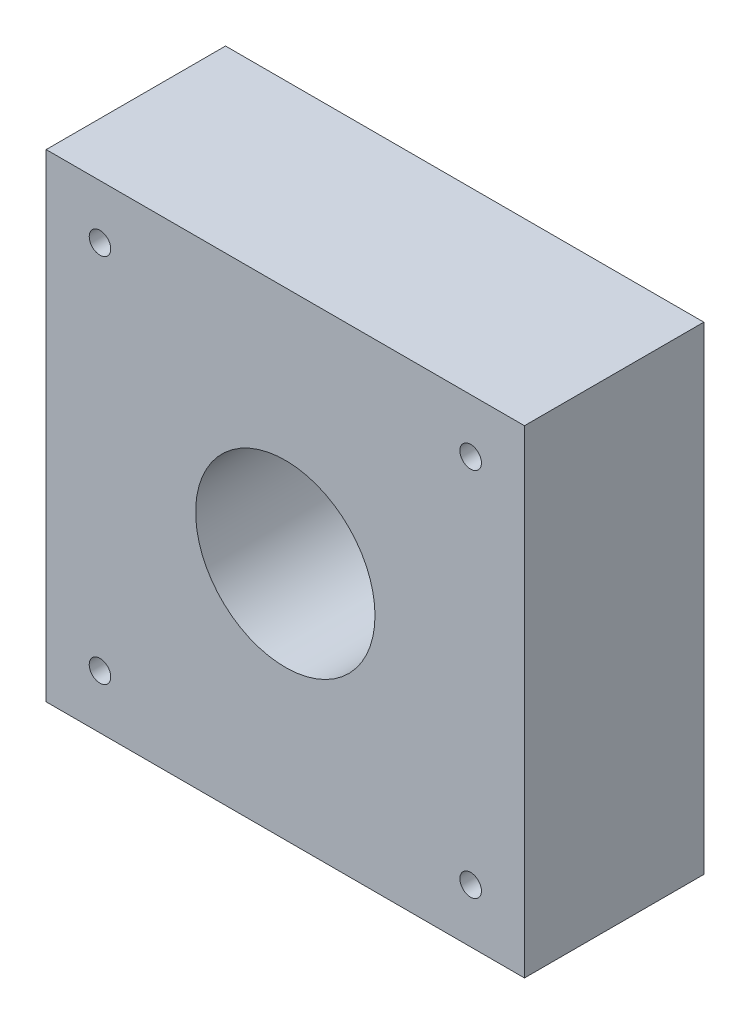
ISO-10303-21;
HEADER;
FILE_DESCRIPTION(('STEP AP214'),'2;1');
FILE_NAME('part.step','',(''),(''),'','','');
FILE_SCHEMA(('AUTOMOTIVE_DESIGN { 1 0 10303 214 1 1 1 1 }'));
ENDSEC;
DATA;
#1=APPLICATION_CONTEXT('core data for automotive mechanical design processes');
#2=APPLICATION_PROTOCOL_DEFINITION('international standard','automotive_design',2000,#1);
#3=PRODUCT_CONTEXT('',#1,'mechanical');
#4=PRODUCT('Part','Part','',(#3));
#5=PRODUCT_RELATED_PRODUCT_CATEGORY('part','',(#4));
#6=PRODUCT_DEFINITION_FORMATION('','',#4);
#7=PRODUCT_DEFINITION_CONTEXT('part definition',#1,'design');
#8=PRODUCT_DEFINITION('design','',#6,#7);
#9=PRODUCT_DEFINITION_SHAPE('','',#8);
#10=(LENGTH_UNIT() NAMED_UNIT(*) SI_UNIT(.MILLI.,.METRE.));
#11=(NAMED_UNIT(*) PLANE_ANGLE_UNIT() SI_UNIT($,.RADIAN.));
#12=(NAMED_UNIT(*) SI_UNIT($,.STERADIAN.) SOLID_ANGLE_UNIT());
#13=UNCERTAINTY_MEASURE_WITH_UNIT(LENGTH_MEASURE(1.E-05),#10,'distance_accuracy_value','');
#14=(GEOMETRIC_REPRESENTATION_CONTEXT(3) GLOBAL_UNCERTAINTY_ASSIGNED_CONTEXT((#13)) GLOBAL_UNIT_ASSIGNED_CONTEXT((#10,
#11,#12)) REPRESENTATION_CONTEXT('',''));
#15=CARTESIAN_POINT('',(0.,0.,0.));
#16=DIRECTION('',(0.,0.,1.));
#17=DIRECTION('',(1.,0.,0.));
#18=AXIS2_PLACEMENT_3D('',#15,#16,#17);
#19=CARTESIAN_POINT('',(-15.5208333333333,24.375,15.));
#20=DIRECTION('',(1.,0.,0.));
#21=DIRECTION('',(0.,1.,0.));
#22=AXIS2_PLACEMENT_3D('',#19,#20,#21);
#23=PLANE('',#22);
#24=DIRECTION('',(0.,-1.,0.));
#25=VECTOR('',#24,1.);
#26=CARTESIAN_POINT('',(-15.5208333333333,24.375,0.));
#27=LINE('',#26,#25);
#28=CARTESIAN_POINT('',(-15.5208333333333,24.375,0.));
#29=VERTEX_POINT('',#28);
#30=CARTESIAN_POINT('',(-15.5208333333333,-15.625,0.));
#31=VERTEX_POINT('',#30);
#32=EDGE_CURVE('E113',#29,#31,#27,.T.);
#33=ORIENTED_EDGE('',*,*,#32,.T.);
#34=DIRECTION('',(0.,0.,-1.));
#35=VECTOR('',#34,1.);
#36=CARTESIAN_POINT('',(-15.5208333333333,-15.625,15.));
#37=LINE('',#36,#35);
#38=CARTESIAN_POINT('',(-15.5208333333333,-15.625,15.));
#39=VERTEX_POINT('',#38);
#40=EDGE_CURVE('E11',#39,#31,#37,.T.);
#41=ORIENTED_EDGE('',*,*,#40,.F.);
#42=DIRECTION('',(0.,-1.,0.));
#43=VECTOR('',#42,1.);
#44=CARTESIAN_POINT('',(-15.5208333333333,24.375,15.));
#45=LINE('',#44,#43);
#46=CARTESIAN_POINT('',(-15.5208333333333,24.375,15.));
#47=VERTEX_POINT('',#46);
#48=EDGE_CURVE('E97',#47,#39,#45,.T.);
#49=ORIENTED_EDGE('',*,*,#48,.F.);
#50=DIRECTION('',(0.,0.,-1.));
#51=VECTOR('',#50,1.);
#52=CARTESIAN_POINT('',(-15.5208333333333,24.375,15.));
#53=LINE('',#52,#51);
#54=EDGE_CURVE('E109',#47,#29,#53,.T.);
#55=ORIENTED_EDGE('',*,*,#54,.T.);
#56=EDGE_LOOP('',(#33,#41,#49,#55));
#57=FACE_BOUND('',#56,.T.);
#58=ADVANCED_FACE('F45',(#57),#23,.F.);
#59=CARTESIAN_POINT('',(-15.5208333333333,-15.625,15.));
#60=DIRECTION('',(0.,1.,0.));
#61=DIRECTION('',(0.,0.,1.));
#62=AXIS2_PLACEMENT_3D('',#59,#60,#61);
#63=PLANE('',#62);
#64=DIRECTION('',(1.,0.,0.));
#65=VECTOR('',#64,1.);
#66=CARTESIAN_POINT('',(-15.5208333333333,-15.625,0.));
#67=LINE('',#66,#65);
#68=CARTESIAN_POINT('',(24.4791666666667,-15.625,0.));
#69=VERTEX_POINT('',#68);
#70=EDGE_CURVE('E102',#31,#69,#67,.T.);
#71=ORIENTED_EDGE('',*,*,#70,.T.);
#72=DIRECTION('',(0.,0.,-1.));
#73=VECTOR('',#72,1.);
#74=CARTESIAN_POINT('',(24.4791666666667,-15.625,15.));
#75=LINE('',#74,#73);
#76=CARTESIAN_POINT('',(24.4791666666667,-15.625,15.));
#77=VERTEX_POINT('',#76);
#78=EDGE_CURVE('E54',#77,#69,#75,.T.);
#79=ORIENTED_EDGE('',*,*,#78,.F.);
#80=DIRECTION('',(1.,0.,0.));
#81=VECTOR('',#80,1.);
#82=CARTESIAN_POINT('',(-15.5208333333333,-15.625,15.));
#83=LINE('',#82,#81);
#84=EDGE_CURVE('E92',#39,#77,#83,.T.);
#85=ORIENTED_EDGE('',*,*,#84,.F.);
#86=ORIENTED_EDGE('',*,*,#40,.T.);
#87=EDGE_LOOP('',(#71,#79,#85,#86));
#88=FACE_BOUND('',#87,.T.);
#89=ADVANCED_FACE('F101',(#88),#63,.F.);
#90=CARTESIAN_POINT('',(24.4791666666667,24.375,15.));
#91=DIRECTION('',(-1.,0.,0.));
#92=DIRECTION('',(0.,-1.,0.));
#93=AXIS2_PLACEMENT_3D('',#90,#91,#92);
#94=PLANE('',#93);
#95=DIRECTION('',(0.,1.,0.));
#96=VECTOR('',#95,1.);
#97=CARTESIAN_POINT('',(24.4791666666667,24.375,0.));
#98=LINE('',#97,#96);
#99=CARTESIAN_POINT('',(24.4791666666667,24.375,0.));
#100=VERTEX_POINT('',#99);
#101=EDGE_CURVE('E79',#69,#100,#98,.T.);
#102=ORIENTED_EDGE('',*,*,#101,.T.);
#103=DIRECTION('',(0.,0.,-1.));
#104=VECTOR('',#103,1.);
#105=CARTESIAN_POINT('',(24.4791666666667,24.375,15.));
#106=LINE('',#105,#104);
#107=CARTESIAN_POINT('',(24.4791666666667,24.375,15.));
#108=VERTEX_POINT('',#107);
#109=EDGE_CURVE('E104',#108,#100,#106,.T.);
#110=ORIENTED_EDGE('',*,*,#109,.F.);
#111=DIRECTION('',(0.,1.,0.));
#112=VECTOR('',#111,1.);
#113=CARTESIAN_POINT('',(24.4791666666667,24.375,15.));
#114=LINE('',#113,#112);
#115=EDGE_CURVE('E95',#77,#108,#114,.T.);
#116=ORIENTED_EDGE('',*,*,#115,.F.);
#117=ORIENTED_EDGE('',*,*,#78,.T.);
#118=EDGE_LOOP('',(#102,#110,#116,#117));
#119=FACE_BOUND('',#118,.T.);
#120=ADVANCED_FACE('F105',(#119),#94,.F.);
#121=CARTESIAN_POINT('',(-15.5208333333333,24.375,15.));
#122=DIRECTION('',(0.,-1.,0.));
#123=DIRECTION('',(0.,0.,-1.));
#124=AXIS2_PLACEMENT_3D('',#121,#122,#123);
#125=PLANE('',#124);
#126=DIRECTION('',(-1.,0.,0.));
#127=VECTOR('',#126,1.);
#128=CARTESIAN_POINT('',(-15.5208333333333,24.375,0.));
#129=LINE('',#128,#127);
#130=EDGE_CURVE('E85',#100,#29,#129,.T.);
#131=ORIENTED_EDGE('',*,*,#130,.T.);
#132=ORIENTED_EDGE('',*,*,#54,.F.);
#133=DIRECTION('',(-1.,0.,0.));
#134=VECTOR('',#133,1.);
#135=CARTESIAN_POINT('',(-15.5208333333333,24.375,15.));
#136=LINE('',#135,#134);
#137=EDGE_CURVE('E62',#108,#47,#136,.T.);
#138=ORIENTED_EDGE('',*,*,#137,.F.);
#139=ORIENTED_EDGE('',*,*,#109,.T.);
#140=EDGE_LOOP('',(#131,#132,#138,#139));
#141=FACE_BOUND('',#140,.T.);
#142=ADVANCED_FACE('F127',(#141),#125,.F.);
#143=CARTESIAN_POINT('',(0.,0.,15.));
#144=DIRECTION('',(0.,0.,1.));
#145=DIRECTION('',(1.,0.,0.));
#146=AXIS2_PLACEMENT_3D('',#143,#144,#145);
#147=PLANE('',#146);
#148=CARTESIAN_POINT('',(19.9791666666667,19.875,15.));
#149=DIRECTION('',(0.,0.,-1.));
#150=DIRECTION('',(-1.,0.,0.));
#151=AXIS2_PLACEMENT_3D('',#148,#149,#150);
#152=CIRCLE('',#151,0.899999999999998);
#153=CARTESIAN_POINT('',(19.0791666666667,19.875,15.));
#154=VERTEX_POINT('',#153);
#155=EDGE_CURVE('E201',#154,#154,#152,.T.);
#156=ORIENTED_EDGE('',*,*,#155,.T.);
#157=EDGE_LOOP('',(#156));
#158=FACE_BOUND('',#157,.T.);
#159=CARTESIAN_POINT('',(-11.0208333333333,19.875,15.));
#160=DIRECTION('',(0.,0.,-1.));
#161=DIRECTION('',(-1.,0.,0.));
#162=AXIS2_PLACEMENT_3D('',#159,#160,#161);
#163=CIRCLE('',#162,0.899999999999998);
#164=CARTESIAN_POINT('',(-11.9208333333333,19.875,15.));
#165=VERTEX_POINT('',#164);
#166=EDGE_CURVE('E189',#165,#165,#163,.T.);
#167=ORIENTED_EDGE('',*,*,#166,.T.);
#168=EDGE_LOOP('',(#167));
#169=FACE_BOUND('',#168,.T.);
#170=CARTESIAN_POINT('',(-11.0208333333333,-11.125,15.));
#171=DIRECTION('',(0.,0.,-1.));
#172=DIRECTION('',(-1.,0.,0.));
#173=AXIS2_PLACEMENT_3D('',#170,#171,#172);
#174=CIRCLE('',#173,0.899999999999998);
#175=CARTESIAN_POINT('',(-11.9208333333333,-11.125,15.));
#176=VERTEX_POINT('',#175);
#177=EDGE_CURVE('E177',#176,#176,#174,.T.);
#178=ORIENTED_EDGE('',*,*,#177,.T.);
#179=EDGE_LOOP('',(#178));
#180=FACE_BOUND('',#179,.T.);
#181=CARTESIAN_POINT('',(19.9791666666667,-11.125,15.));
#182=DIRECTION('',(0.,0.,-1.));
#183=DIRECTION('',(-1.,0.,0.));
#184=AXIS2_PLACEMENT_3D('',#181,#182,#183);
#185=CIRCLE('',#184,0.899999999999998);
#186=CARTESIAN_POINT('',(19.0791666666667,-11.125,15.));
#187=VERTEX_POINT('',#186);
#188=EDGE_CURVE('E165',#187,#187,#185,.T.);
#189=ORIENTED_EDGE('',*,*,#188,.T.);
#190=EDGE_LOOP('',(#189));
#191=FACE_BOUND('',#190,.T.);
#192=CARTESIAN_POINT('',(4.47916666666668,4.375,15.));
#193=DIRECTION('',(0.,0.,1.));
#194=DIRECTION('',(1.,0.,0.));
#195=AXIS2_PLACEMENT_3D('',#192,#193,#194);
#196=CIRCLE('',#195,7.5);
#197=CARTESIAN_POINT('',(11.9791666666667,4.375,15.));
#198=VERTEX_POINT('',#197);
#199=EDGE_CURVE('E134',#198,#198,#196,.T.);
#200=ORIENTED_EDGE('',*,*,#199,.F.);
#201=EDGE_LOOP('',(#200));
#202=FACE_BOUND('',#201,.T.);
#203=ORIENTED_EDGE('',*,*,#48,.T.);
#204=ORIENTED_EDGE('',*,*,#84,.T.);
#205=ORIENTED_EDGE('',*,*,#115,.T.);
#206=ORIENTED_EDGE('',*,*,#137,.T.);
#207=EDGE_LOOP('',(#203,#204,#205,#206));
#208=FACE_BOUND('',#207,.T.);
#209=ADVANCED_FACE('F93',(#158,#169,#180,#191,#202,#208),#147,.T.);
#210=CARTESIAN_POINT('',(0.,0.,0.));
#211=DIRECTION('',(0.,0.,1.));
#212=DIRECTION('',(1.,0.,0.));
#213=AXIS2_PLACEMENT_3D('',#210,#211,#212);
#214=PLANE('',#213);
#215=CARTESIAN_POINT('',(19.9791666666667,19.875,0.));
#216=DIRECTION('',(0.,0.,-1.));
#217=DIRECTION('',(-1.,0.,0.));
#218=AXIS2_PLACEMENT_3D('',#215,#216,#217);
#219=CIRCLE('',#218,1.8);
#220=CARTESIAN_POINT('',(18.1791666666667,19.875,0.));
#221=VERTEX_POINT('',#220);
#222=EDGE_CURVE('E209',#221,#221,#219,.T.);
#223=ORIENTED_EDGE('',*,*,#222,.F.);
#224=EDGE_LOOP('',(#223));
#225=FACE_BOUND('',#224,.T.);
#226=CARTESIAN_POINT('',(-11.0208333333333,19.875,0.));
#227=DIRECTION('',(0.,0.,-1.));
#228=DIRECTION('',(-1.,0.,0.));
#229=AXIS2_PLACEMENT_3D('',#226,#227,#228);
#230=CIRCLE('',#229,1.8);
#231=CARTESIAN_POINT('',(-12.8208333333333,19.875,0.));
#232=VERTEX_POINT('',#231);
#233=EDGE_CURVE('E197',#232,#232,#230,.T.);
#234=ORIENTED_EDGE('',*,*,#233,.F.);
#235=EDGE_LOOP('',(#234));
#236=FACE_BOUND('',#235,.T.);
#237=CARTESIAN_POINT('',(-11.0208333333333,-11.125,0.));
#238=DIRECTION('',(0.,0.,-1.));
#239=DIRECTION('',(-1.,0.,0.));
#240=AXIS2_PLACEMENT_3D('',#237,#238,#239);
#241=CIRCLE('',#240,1.8);
#242=CARTESIAN_POINT('',(-12.8208333333333,-11.125,0.));
#243=VERTEX_POINT('',#242);
#244=EDGE_CURVE('E185',#243,#243,#241,.T.);
#245=ORIENTED_EDGE('',*,*,#244,.F.);
#246=EDGE_LOOP('',(#245));
#247=FACE_BOUND('',#246,.T.);
#248=CARTESIAN_POINT('',(19.9791666666667,-11.125,0.));
#249=DIRECTION('',(0.,0.,-1.));
#250=DIRECTION('',(-1.,0.,0.));
#251=AXIS2_PLACEMENT_3D('',#248,#249,#250);
#252=CIRCLE('',#251,1.8);
#253=CARTESIAN_POINT('',(18.1791666666667,-11.125,0.));
#254=VERTEX_POINT('',#253);
#255=EDGE_CURVE('E173',#254,#254,#252,.T.);
#256=ORIENTED_EDGE('',*,*,#255,.F.);
#257=EDGE_LOOP('',(#256));
#258=FACE_BOUND('',#257,.T.);
#259=CARTESIAN_POINT('',(4.47916666666668,8.875,0.));
#260=DIRECTION('',(0.,0.,1.));
#261=DIRECTION('',(1.,0.,0.));
#262=AXIS2_PLACEMENT_3D('',#259,#260,#261);
#263=CIRCLE('',#262,0.899999999999999);
#264=CARTESIAN_POINT('',(5.37916666666668,8.875,0.));
#265=VERTEX_POINT('',#264);
#266=EDGE_CURVE('E157',#265,#265,#263,.T.);
#267=ORIENTED_EDGE('',*,*,#266,.T.);
#268=EDGE_LOOP('',(#267));
#269=FACE_BOUND('',#268,.T.);
#270=CARTESIAN_POINT('',(4.47916666666668,-0.124999999999999,0.));
#271=DIRECTION('',(0.,0.,1.));
#272=DIRECTION('',(1.,0.,0.));
#273=AXIS2_PLACEMENT_3D('',#270,#271,#272);
#274=CIRCLE('',#273,0.899999999999999);
#275=CARTESIAN_POINT('',(5.37916666666668,-0.124999999999999,0.));
#276=VERTEX_POINT('',#275);
#277=EDGE_CURVE('E149',#276,#276,#274,.T.);
#278=ORIENTED_EDGE('',*,*,#277,.T.);
#279=EDGE_LOOP('',(#278));
#280=FACE_BOUND('',#279,.T.);
#281=CARTESIAN_POINT('',(4.47916666666668,4.375,0.));
#282=DIRECTION('',(0.,0.,1.));
#283=DIRECTION('',(1.,0.,0.));
#284=AXIS2_PLACEMENT_3D('',#281,#282,#283);
#285=CIRCLE('',#284,2.25);
#286=CARTESIAN_POINT('',(6.72916666666668,4.375,0.));
#287=VERTEX_POINT('',#286);
#288=EDGE_CURVE('E138',#287,#287,#285,.T.);
#289=ORIENTED_EDGE('',*,*,#288,.T.);
#290=EDGE_LOOP('',(#289));
#291=FACE_BOUND('',#290,.T.);
#292=ORIENTED_EDGE('',*,*,#32,.F.);
#293=ORIENTED_EDGE('',*,*,#130,.F.);
#294=ORIENTED_EDGE('',*,*,#101,.F.);
#295=ORIENTED_EDGE('',*,*,#70,.F.);
#296=EDGE_LOOP('',(#292,#293,#294,#295));
#297=FACE_BOUND('',#296,.T.);
#298=ADVANCED_FACE('F130',(#225,#236,#247,#258,#269,#280,#291,#297),#214,.F.);
#299=CARTESIAN_POINT('',(4.47916666666668,4.375,3.));
#300=DIRECTION('',(0.,0.,1.));
#301=DIRECTION('',(1.,0.,0.));
#302=AXIS2_PLACEMENT_3D('',#299,#300,#301);
#303=CYLINDRICAL_SURFACE('',#302,7.5);
#304=CARTESIAN_POINT('',(4.47916666666668,4.375,3.));
#305=DIRECTION('',(0.,0.,1.));
#306=DIRECTION('',(1.,0.,0.));
#307=AXIS2_PLACEMENT_3D('',#304,#305,#306);
#308=CIRCLE('',#307,7.5);
#309=CARTESIAN_POINT('',(11.9791666666667,4.375,3.));
#310=VERTEX_POINT('',#309);
#311=EDGE_CURVE('E117',#310,#310,#308,.T.);
#312=ORIENTED_EDGE('',*,*,#311,.F.);
#313=EDGE_LOOP('',(#312));
#314=FACE_BOUND('',#313,.T.);
#315=ORIENTED_EDGE('',*,*,#199,.T.);
#316=EDGE_LOOP('',(#315));
#317=FACE_BOUND('',#316,.T.);
#318=ADVANCED_FACE('F218',(#314,#317),#303,.F.);
#319=CARTESIAN_POINT('',(4.47916666666668,4.375,3.));
#320=DIRECTION('',(0.,0.,1.));
#321=DIRECTION('',(1.,0.,0.));
#322=AXIS2_PLACEMENT_3D('',#319,#320,#321);
#323=PLANE('',#322);
#324=CARTESIAN_POINT('',(4.47916666666668,8.875,3.));
#325=DIRECTION('',(0.,0.,1.));
#326=DIRECTION('',(1.,0.,0.));
#327=AXIS2_PLACEMENT_3D('',#324,#325,#326);
#328=CIRCLE('',#327,0.9);
#329=CARTESIAN_POINT('',(5.37916666666668,8.875,3.));
#330=VERTEX_POINT('',#329);
#331=EDGE_CURVE('E161',#330,#330,#328,.T.);
#332=ORIENTED_EDGE('',*,*,#331,.F.);
#333=EDGE_LOOP('',(#332));
#334=FACE_BOUND('',#333,.T.);
#335=CARTESIAN_POINT('',(4.47916666666668,-0.124999999999999,3.));
#336=DIRECTION('',(0.,0.,1.));
#337=DIRECTION('',(1.,0.,0.));
#338=AXIS2_PLACEMENT_3D('',#335,#336,#337);
#339=CIRCLE('',#338,0.9);
#340=CARTESIAN_POINT('',(5.37916666666668,-0.124999999999999,3.));
#341=VERTEX_POINT('',#340);
#342=EDGE_CURVE('E153',#341,#341,#339,.T.);
#343=ORIENTED_EDGE('',*,*,#342,.F.);
#344=EDGE_LOOP('',(#343));
#345=FACE_BOUND('',#344,.T.);
#346=CARTESIAN_POINT('',(4.47916666666668,4.375,3.));
#347=DIRECTION('',(0.,0.,1.));
#348=DIRECTION('',(1.,0.,0.));
#349=AXIS2_PLACEMENT_3D('',#346,#347,#348);
#350=CIRCLE('',#349,2.25);
#351=CARTESIAN_POINT('',(6.72916666666668,4.375,3.));
#352=VERTEX_POINT('',#351);
#353=EDGE_CURVE('E145',#352,#352,#350,.T.);
#354=ORIENTED_EDGE('',*,*,#353,.F.);
#355=EDGE_LOOP('',(#354));
#356=FACE_BOUND('',#355,.T.);
#357=ORIENTED_EDGE('',*,*,#311,.T.);
#358=EDGE_LOOP('',(#357));
#359=FACE_BOUND('',#358,.T.);
#360=ADVANCED_FACE('F236',(#334,#345,#356,#359),#323,.T.);
#361=CARTESIAN_POINT('',(4.47916666666668,4.375,3.));
#362=DIRECTION('',(0.,0.,1.));
#363=DIRECTION('',(1.,0.,0.));
#364=AXIS2_PLACEMENT_3D('',#361,#362,#363);
#365=CYLINDRICAL_SURFACE('',#364,2.25);
#366=ORIENTED_EDGE('',*,*,#288,.F.);
#367=EDGE_LOOP('',(#366));
#368=FACE_BOUND('',#367,.T.);
#369=ORIENTED_EDGE('',*,*,#353,.T.);
#370=EDGE_LOOP('',(#369));
#371=FACE_BOUND('',#370,.T.);
#372=ADVANCED_FACE('F232',(#368,#371),#365,.F.);
#373=CARTESIAN_POINT('',(4.47916666666668,-0.124999999999999,3.));
#374=DIRECTION('',(0.,0.,1.));
#375=DIRECTION('',(1.,0.,0.));
#376=AXIS2_PLACEMENT_3D('',#373,#374,#375);
#377=CYLINDRICAL_SURFACE('',#376,0.899999999999999);
#378=ORIENTED_EDGE('',*,*,#277,.F.);
#379=EDGE_LOOP('',(#378));
#380=FACE_BOUND('',#379,.T.);
#381=ORIENTED_EDGE('',*,*,#342,.T.);
#382=EDGE_LOOP('',(#381));
#383=FACE_BOUND('',#382,.T.);
#384=ADVANCED_FACE('F235',(#380,#383),#377,.F.);
#385=CARTESIAN_POINT('',(4.47916666666668,8.875,3.));
#386=DIRECTION('',(0.,0.,1.));
#387=DIRECTION('',(1.,0.,0.));
#388=AXIS2_PLACEMENT_3D('',#385,#386,#387);
#389=CYLINDRICAL_SURFACE('',#388,0.899999999999999);
#390=ORIENTED_EDGE('',*,*,#266,.F.);
#391=EDGE_LOOP('',(#390));
#392=FACE_BOUND('',#391,.T.);
#393=ORIENTED_EDGE('',*,*,#331,.T.);
#394=EDGE_LOOP('',(#393));
#395=FACE_BOUND('',#394,.T.);
#396=ADVANCED_FACE('F305',(#392,#395),#389,.F.);
#397=CARTESIAN_POINT('',(19.9791666666667,-11.125,0.));
#398=DIRECTION('',(0.,0.,-1.));
#399=DIRECTION('',(-1.,0.,0.));
#400=AXIS2_PLACEMENT_3D('',#397,#398,#399);
#401=CYLINDRICAL_SURFACE('',#400,0.899999999999998);
#402=ORIENTED_EDGE('',*,*,#188,.F.);
#403=EDGE_LOOP('',(#402));
#404=FACE_BOUND('',#403,.T.);
#405=CARTESIAN_POINT('',(19.9791666666667,-11.125,0.899999999999999));
#406=DIRECTION('',(0.,0.,-1.));
#407=DIRECTION('',(-1.,0.,0.));
#408=AXIS2_PLACEMENT_3D('',#405,#406,#407);
#409=CIRCLE('',#408,0.899999999999998);
#410=CARTESIAN_POINT('',(19.0791666666667,-11.125,0.899999999999999));
#411=VERTEX_POINT('',#410);
#412=EDGE_CURVE('E169',#411,#411,#409,.T.);
#413=ORIENTED_EDGE('',*,*,#412,.T.);
#414=EDGE_LOOP('',(#413));
#415=FACE_BOUND('',#414,.T.);
#416=ADVANCED_FACE('F315',(#404,#415),#401,.F.);
#417=CARTESIAN_POINT('',(19.9791666666667,-11.125,0.));
#418=DIRECTION('',(0.,0.,-1.));
#419=DIRECTION('',(-1.,0.,0.));
#420=AXIS2_PLACEMENT_3D('',#417,#418,#419);
#421=CONICAL_SURFACE('',#420,1.8,0.785398163397449);
#422=ORIENTED_EDGE('',*,*,#412,.F.);
#423=EDGE_LOOP('',(#422));
#424=FACE_BOUND('',#423,.T.);
#425=ORIENTED_EDGE('',*,*,#255,.T.);
#426=EDGE_LOOP('',(#425));
#427=FACE_BOUND('',#426,.T.);
#428=ADVANCED_FACE('F335',(#424,#427),#421,.F.);
#429=CARTESIAN_POINT('',(-11.0208333333333,-11.125,0.));
#430=DIRECTION('',(0.,0.,-1.));
#431=DIRECTION('',(-1.,0.,0.));
#432=AXIS2_PLACEMENT_3D('',#429,#430,#431);
#433=CYLINDRICAL_SURFACE('',#432,0.899999999999999);
#434=ORIENTED_EDGE('',*,*,#177,.F.);
#435=EDGE_LOOP('',(#434));
#436=FACE_BOUND('',#435,.T.);
#437=CARTESIAN_POINT('',(-11.0208333333333,-11.125,0.899999999999999));
#438=DIRECTION('',(0.,0.,-1.));
#439=DIRECTION('',(-1.,0.,0.));
#440=AXIS2_PLACEMENT_3D('',#437,#438,#439);
#441=CIRCLE('',#440,0.9);
#442=CARTESIAN_POINT('',(-11.9208333333333,-11.125,0.899999999999999));
#443=VERTEX_POINT('',#442);
#444=EDGE_CURVE('E181',#443,#443,#441,.T.);
#445=ORIENTED_EDGE('',*,*,#444,.T.);
#446=EDGE_LOOP('',(#445));
#447=FACE_BOUND('',#446,.T.);
#448=ADVANCED_FACE('F346',(#436,#447),#433,.F.);
#449=CARTESIAN_POINT('',(-11.0208333333333,-11.125,0.));
#450=DIRECTION('',(0.,0.,-1.));
#451=DIRECTION('',(-1.,0.,0.));
#452=AXIS2_PLACEMENT_3D('',#449,#450,#451);
#453=CONICAL_SURFACE('',#452,1.8,0.785398163397448);
#454=ORIENTED_EDGE('',*,*,#444,.F.);
#455=EDGE_LOOP('',(#454));
#456=FACE_BOUND('',#455,.T.);
#457=ORIENTED_EDGE('',*,*,#244,.T.);
#458=EDGE_LOOP('',(#457));
#459=FACE_BOUND('',#458,.T.);
#460=ADVANCED_FACE('F357',(#456,#459),#453,.F.);
#461=CARTESIAN_POINT('',(-11.0208333333333,19.875,0.));
#462=DIRECTION('',(0.,0.,-1.));
#463=DIRECTION('',(-1.,0.,0.));
#464=AXIS2_PLACEMENT_3D('',#461,#462,#463);
#465=CYLINDRICAL_SURFACE('',#464,0.899999999999999);
#466=ORIENTED_EDGE('',*,*,#166,.F.);
#467=EDGE_LOOP('',(#466));
#468=FACE_BOUND('',#467,.T.);
#469=CARTESIAN_POINT('',(-11.0208333333333,19.875,0.899999999999999));
#470=DIRECTION('',(0.,0.,-1.));
#471=DIRECTION('',(-1.,0.,0.));
#472=AXIS2_PLACEMENT_3D('',#469,#470,#471);
#473=CIRCLE('',#472,0.9);
#474=CARTESIAN_POINT('',(-11.9208333333333,19.875,0.899999999999999));
#475=VERTEX_POINT('',#474);
#476=EDGE_CURVE('E193',#475,#475,#473,.T.);
#477=ORIENTED_EDGE('',*,*,#476,.T.);
#478=EDGE_LOOP('',(#477));
#479=FACE_BOUND('',#478,.T.);
#480=ADVANCED_FACE('F368',(#468,#479),#465,.F.);
#481=CARTESIAN_POINT('',(-11.0208333333333,19.875,0.));
#482=DIRECTION('',(0.,0.,-1.));
#483=DIRECTION('',(-1.,0.,0.));
#484=AXIS2_PLACEMENT_3D('',#481,#482,#483);
#485=CONICAL_SURFACE('',#484,1.8,0.785398163397448);
#486=ORIENTED_EDGE('',*,*,#476,.F.);
#487=EDGE_LOOP('',(#486));
#488=FACE_BOUND('',#487,.T.);
#489=ORIENTED_EDGE('',*,*,#233,.T.);
#490=EDGE_LOOP('',(#489));
#491=FACE_BOUND('',#490,.T.);
#492=ADVANCED_FACE('F379',(#488,#491),#485,.F.);
#493=CARTESIAN_POINT('',(19.9791666666667,19.875,0.));
#494=DIRECTION('',(0.,0.,-1.));
#495=DIRECTION('',(-1.,0.,0.));
#496=AXIS2_PLACEMENT_3D('',#493,#494,#495);
#497=CYLINDRICAL_SURFACE('',#496,0.899999999999998);
#498=ORIENTED_EDGE('',*,*,#155,.F.);
#499=EDGE_LOOP('',(#498));
#500=FACE_BOUND('',#499,.T.);
#501=CARTESIAN_POINT('',(19.9791666666667,19.875,0.899999999999999));
#502=DIRECTION('',(0.,0.,-1.));
#503=DIRECTION('',(-1.,0.,0.));
#504=AXIS2_PLACEMENT_3D('',#501,#502,#503);
#505=CIRCLE('',#504,0.899999999999998);
#506=CARTESIAN_POINT('',(19.0791666666667,19.875,0.899999999999999));
#507=VERTEX_POINT('',#506);
#508=EDGE_CURVE('E205',#507,#507,#505,.T.);
#509=ORIENTED_EDGE('',*,*,#508,.T.);
#510=EDGE_LOOP('',(#509));
#511=FACE_BOUND('',#510,.T.);
#512=ADVANCED_FACE('F390',(#500,#511),#497,.F.);
#513=CARTESIAN_POINT('',(19.9791666666667,19.875,0.));
#514=DIRECTION('',(0.,0.,-1.));
#515=DIRECTION('',(-1.,0.,0.));
#516=AXIS2_PLACEMENT_3D('',#513,#514,#515);
#517=CONICAL_SURFACE('',#516,1.8,0.785398163397449);
#518=ORIENTED_EDGE('',*,*,#508,.F.);
#519=EDGE_LOOP('',(#518));
#520=FACE_BOUND('',#519,.T.);
#521=ORIENTED_EDGE('',*,*,#222,.T.);
#522=EDGE_LOOP('',(#521));
#523=FACE_BOUND('',#522,.T.);
#524=ADVANCED_FACE('F214',(#520,#523),#517,.F.);
#525=CLOSED_SHELL('',(#58,#89,#120,#142,#209,#298,#318,#360,#372,#384,#396,#416,#428,#448,#460,
#480,#492,#512,#524));
#526=MANIFOLD_SOLID_BREP('B2',#525);
#527=ADVANCED_BREP_SHAPE_REPRESENTATION('',(#18,#526),#14);
#528=SHAPE_DEFINITION_REPRESENTATION(#9,#527);
ENDSEC;
END-ISO-10303-21;
